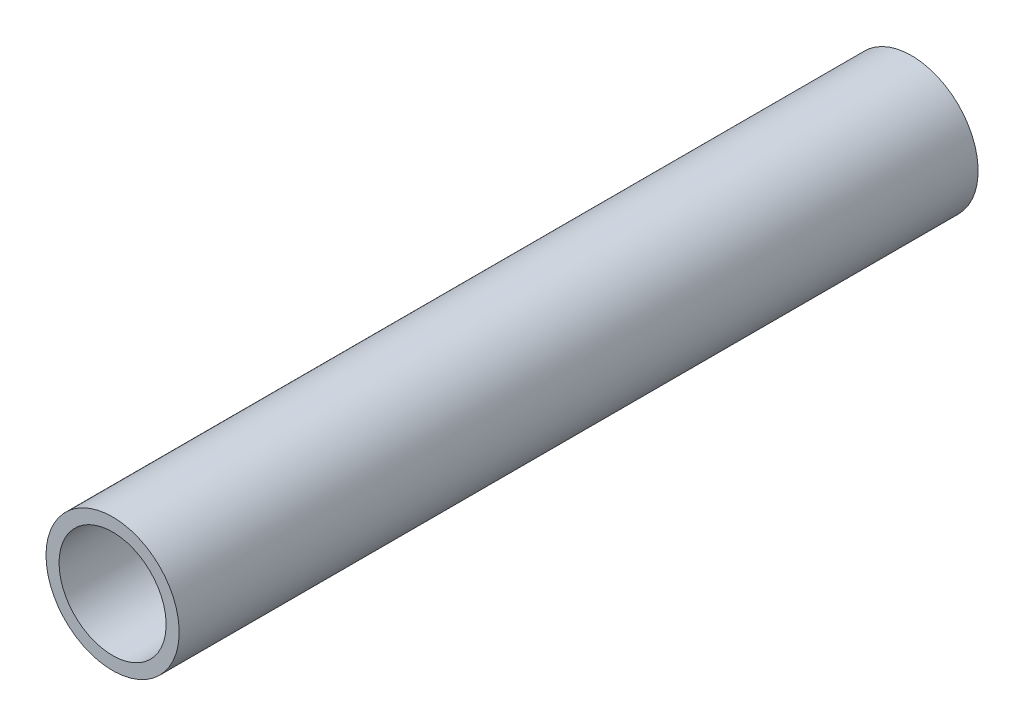
ISO-10303-21;
HEADER;
FILE_DESCRIPTION(('STEP AP214'),'2;1');
FILE_NAME('part.step','',(''),(''),'','','');
FILE_SCHEMA(('AUTOMOTIVE_DESIGN { 1 0 10303 214 1 1 1 1 }'));
ENDSEC;
DATA;
#1=APPLICATION_CONTEXT('core data for automotive mechanical design processes');
#2=APPLICATION_PROTOCOL_DEFINITION('international standard','automotive_design',2000,#1);
#3=PRODUCT_CONTEXT('',#1,'mechanical');
#4=PRODUCT('Part','Part','',(#3));
#5=PRODUCT_RELATED_PRODUCT_CATEGORY('part','',(#4));
#6=PRODUCT_DEFINITION_FORMATION('','',#4);
#7=PRODUCT_DEFINITION_CONTEXT('part definition',#1,'design');
#8=PRODUCT_DEFINITION('design','',#6,#7);
#9=PRODUCT_DEFINITION_SHAPE('','',#8);
#10=(LENGTH_UNIT() NAMED_UNIT(*) SI_UNIT(.MILLI.,.METRE.));
#11=(NAMED_UNIT(*) PLANE_ANGLE_UNIT() SI_UNIT($,.RADIAN.));
#12=(NAMED_UNIT(*) SI_UNIT($,.STERADIAN.) SOLID_ANGLE_UNIT());
#13=UNCERTAINTY_MEASURE_WITH_UNIT(LENGTH_MEASURE(1.E-05),#10,'distance_accuracy_value','');
#14=(GEOMETRIC_REPRESENTATION_CONTEXT(3) GLOBAL_UNCERTAINTY_ASSIGNED_CONTEXT((#13)) GLOBAL_UNIT_ASSIGNED_CONTEXT((#10,
#11,#12)) REPRESENTATION_CONTEXT('',''));
#15=CARTESIAN_POINT('',(0.,0.,0.));
#16=DIRECTION('',(0.,0.,1.));
#17=DIRECTION('',(1.,0.,0.));
#18=AXIS2_PLACEMENT_3D('',#15,#16,#17);
#19=CARTESIAN_POINT('',(0.,0.,76.2));
#20=DIRECTION('',(0.,0.,1.));
#21=DIRECTION('',(1.,0.,0.));
#22=AXIS2_PLACEMENT_3D('',#19,#20,#21);
#23=PLANE('',#22);
#24=CARTESIAN_POINT('',(0.,0.,76.2));
#25=DIRECTION('',(0.,0.,1.));
#26=DIRECTION('',(1.,0.,0.));
#27=AXIS2_PLACEMENT_3D('',#24,#25,#26);
#28=CIRCLE('',#27,6.35);
#29=CARTESIAN_POINT('',(-6.35,0.,76.2));
#30=VERTEX_POINT('',#29);
#31=EDGE_CURVE('E10',#30,#30,#28,.T.);
#32=ORIENTED_EDGE('',*,*,#31,.T.);
#33=EDGE_LOOP('',(#32));
#34=FACE_BOUND('',#33,.T.);
#35=CARTESIAN_POINT('',(0.,0.,76.2));
#36=DIRECTION('',(0.,0.,1.));
#37=DIRECTION('',(1.,0.,0.));
#38=AXIS2_PLACEMENT_3D('',#35,#36,#37);
#39=CIRCLE('',#38,5.1054);
#40=CARTESIAN_POINT('',(-5.1054,0.,76.2));
#41=VERTEX_POINT('',#40);
#42=EDGE_CURVE('E48',#41,#41,#39,.T.);
#43=ORIENTED_EDGE('',*,*,#42,.F.);
#44=EDGE_LOOP('',(#43));
#45=FACE_BOUND('',#44,.T.);
#46=ADVANCED_FACE('F37',(#34,#45),#23,.T.);
#47=CARTESIAN_POINT('',(0.,0.,0.));
#48=DIRECTION('',(0.,0.,1.));
#49=DIRECTION('',(1.,0.,0.));
#50=AXIS2_PLACEMENT_3D('',#47,#48,#49);
#51=PLANE('',#50);
#52=CARTESIAN_POINT('',(0.,0.,0.));
#53=DIRECTION('',(0.,0.,1.));
#54=DIRECTION('',(1.,0.,0.));
#55=AXIS2_PLACEMENT_3D('',#52,#53,#54);
#56=CIRCLE('',#55,6.35);
#57=CARTESIAN_POINT('',(-6.35,0.,0.));
#58=VERTEX_POINT('',#57);
#59=EDGE_CURVE('E41',#58,#58,#56,.T.);
#60=ORIENTED_EDGE('',*,*,#59,.F.);
#61=EDGE_LOOP('',(#60));
#62=FACE_BOUND('',#61,.T.);
#63=CARTESIAN_POINT('',(0.,0.,0.));
#64=DIRECTION('',(0.,0.,1.));
#65=DIRECTION('',(1.,0.,0.));
#66=AXIS2_PLACEMENT_3D('',#63,#64,#65);
#67=CIRCLE('',#66,5.1054);
#68=CARTESIAN_POINT('',(-5.1054,0.,0.));
#69=VERTEX_POINT('',#68);
#70=EDGE_CURVE('E50',#69,#69,#67,.T.);
#71=ORIENTED_EDGE('',*,*,#70,.T.);
#72=EDGE_LOOP('',(#71));
#73=FACE_BOUND('',#72,.T.);
#74=ADVANCED_FACE('F60',(#62,#73),#51,.F.);
#75=CARTESIAN_POINT('',(0.,0.,76.2));
#76=DIRECTION('',(0.,0.,-1.));
#77=DIRECTION('',(-1.,0.,0.));
#78=AXIS2_PLACEMENT_3D('',#75,#76,#77);
#79=CYLINDRICAL_SURFACE('',#78,6.35);
#80=CARTESIAN_POINT('',(-6.35,0.,76.2));
#81=CARTESIAN_POINT('',(-6.35,0.,75.40625));
#82=CARTESIAN_POINT('',(-6.35,0.,74.6125));
#83=CARTESIAN_POINT('',(-6.35,0.,73.025));
#84=CARTESIAN_POINT('',(-6.35,0.,72.23125));
#85=CARTESIAN_POINT('',(-6.35,0.,70.64375));
#86=CARTESIAN_POINT('',(-6.35,0.,69.85));
#87=CARTESIAN_POINT('',(-6.35,0.,68.2625));
#88=CARTESIAN_POINT('',(-6.35,0.,67.46875));
#89=CARTESIAN_POINT('',(-6.35,0.,65.88125));
#90=CARTESIAN_POINT('',(-6.35,0.,65.0875));
#91=CARTESIAN_POINT('',(-6.35,0.,63.5));
#92=CARTESIAN_POINT('',(-6.35,0.,62.70625));
#93=CARTESIAN_POINT('',(-6.35,0.,61.11875));
#94=CARTESIAN_POINT('',(-6.35,0.,60.325));
#95=CARTESIAN_POINT('',(-6.35,0.,58.7375));
#96=CARTESIAN_POINT('',(-6.35,0.,57.94375));
#97=CARTESIAN_POINT('',(-6.35,0.,56.35625));
#98=CARTESIAN_POINT('',(-6.35,0.,55.5625));
#99=CARTESIAN_POINT('',(-6.35,0.,53.975));
#100=CARTESIAN_POINT('',(-6.35,0.,53.18125));
#101=CARTESIAN_POINT('',(-6.35,0.,51.59375));
#102=CARTESIAN_POINT('',(-6.35,0.,50.8));
#103=CARTESIAN_POINT('',(-6.35,0.,49.2125));
#104=CARTESIAN_POINT('',(-6.35,0.,48.41875));
#105=CARTESIAN_POINT('',(-6.35,0.,46.83125));
#106=CARTESIAN_POINT('',(-6.35,0.,46.0375));
#107=CARTESIAN_POINT('',(-6.35,0.,44.45));
#108=CARTESIAN_POINT('',(-6.35,0.,43.65625));
#109=CARTESIAN_POINT('',(-6.35,0.,42.06875));
#110=CARTESIAN_POINT('',(-6.35,0.,41.275));
#111=CARTESIAN_POINT('',(-6.35,0.,39.6875));
#112=CARTESIAN_POINT('',(-6.35,0.,38.89375));
#113=CARTESIAN_POINT('',(-6.35,0.,37.30625));
#114=CARTESIAN_POINT('',(-6.35,0.,36.5125));
#115=CARTESIAN_POINT('',(-6.35,0.,34.925));
#116=CARTESIAN_POINT('',(-6.35,0.,34.13125));
#117=CARTESIAN_POINT('',(-6.35,0.,32.54375));
#118=CARTESIAN_POINT('',(-6.35,0.,31.75));
#119=CARTESIAN_POINT('',(-6.35,0.,30.1625));
#120=CARTESIAN_POINT('',(-6.35,0.,29.36875));
#121=CARTESIAN_POINT('',(-6.35,0.,27.78125));
#122=CARTESIAN_POINT('',(-6.35,0.,26.9875));
#123=CARTESIAN_POINT('',(-6.35,0.,25.4));
#124=CARTESIAN_POINT('',(-6.35,0.,24.60625));
#125=CARTESIAN_POINT('',(-6.35,0.,23.01875));
#126=CARTESIAN_POINT('',(-6.35,0.,22.225));
#127=CARTESIAN_POINT('',(-6.35,0.,20.6375));
#128=CARTESIAN_POINT('',(-6.35,0.,19.84375));
#129=CARTESIAN_POINT('',(-6.35,0.,18.25625));
#130=CARTESIAN_POINT('',(-6.35,0.,17.4625));
#131=CARTESIAN_POINT('',(-6.35,0.,15.875));
#132=CARTESIAN_POINT('',(-6.35,0.,15.08125));
#133=CARTESIAN_POINT('',(-6.35,0.,13.49375));
#134=CARTESIAN_POINT('',(-6.35,0.,12.7));
#135=CARTESIAN_POINT('',(-6.35,0.,11.1125));
#136=CARTESIAN_POINT('',(-6.35,0.,10.31875));
#137=CARTESIAN_POINT('',(-6.35,0.,8.73125));
#138=CARTESIAN_POINT('',(-6.35,0.,7.93750000000001));
#139=CARTESIAN_POINT('',(-6.35,0.,6.35));
#140=CARTESIAN_POINT('',(-6.35,0.,5.55625));
#141=CARTESIAN_POINT('',(-6.35,0.,3.96875));
#142=CARTESIAN_POINT('',(-6.35,0.,3.175));
#143=CARTESIAN_POINT('',(-6.35,0.,1.5875));
#144=CARTESIAN_POINT('',(-6.35,0.,0.793750000000001));
#145=CARTESIAN_POINT('',(-6.35,0.,0.));
#146=B_SPLINE_CURVE_WITH_KNOTS('',3,(#80,#81,#82,#83,#84,#85,#86,#87,#88,#89,#90,#91,#92,#93,
#94,#95,#96,#97,#98,#99,#100,#101,#102,#103,#104,#105,#106,#107,#108,#109,#110,#111,#112,#113,
#114,#115,#116,#117,#118,#119,#120,#121,#122,#123,#124,#125,#126,#127,#128,#129,#130,#131,#132,
#133,#134,#135,#136,#137,#138,#139,#140,#141,#142,#143,#144,#145),.UNSPECIFIED.,.F.,.F.,(4,2,2,
2,2,2,2,2,2,2,2,2,2,2,2,2,2,2,2,2,2,2,2,2,2,2,2,2,2,2,2,2,4),(0.,2.38124999999999,
4.76249999999999,7.14374999999999,9.52499999999999,11.90625,14.2875,16.66875,19.05,21.43125,
23.8125,26.19375,28.575,30.95625,33.3375,35.71875,38.1,40.48125,42.8625,45.24375,47.625,
50.00625,52.3875,54.76875,57.15,59.53125,61.9125,64.29375,66.675,69.05625,71.4375,73.81875,
76.2),.UNSPECIFIED.);
#147=EDGE_CURVE('BSEAM39',#30,#58,#146,.T.);
#148=ORIENTED_EDGE('',*,*,#31,.F.);
#149=ORIENTED_EDGE('',*,*,#59,.T.);
#150=ORIENTED_EDGE('',*,*,#147,.T.);
#151=ORIENTED_EDGE('',*,*,#147,.F.);
#152=EDGE_LOOP('',(#148,#150,#149,#151));
#153=FACE_BOUND('',#152,.T.);
#154=ADVANCED_FACE('F39',(#153),#79,.T.);
#155=CARTESIAN_POINT('',(0.,0.,76.2));
#156=DIRECTION('',(0.,0.,-1.));
#157=DIRECTION('',(-1.,0.,0.));
#158=AXIS2_PLACEMENT_3D('',#155,#156,#157);
#159=CYLINDRICAL_SURFACE('',#158,5.1054);
#160=CARTESIAN_POINT('',(-5.1054,0.,76.2));
#161=CARTESIAN_POINT('',(-5.1054,0.,75.40625));
#162=CARTESIAN_POINT('',(-5.1054,0.,74.6125));
#163=CARTESIAN_POINT('',(-5.1054,0.,73.025));
#164=CARTESIAN_POINT('',(-5.1054,0.,72.23125));
#165=CARTESIAN_POINT('',(-5.1054,0.,70.64375));
#166=CARTESIAN_POINT('',(-5.1054,0.,69.85));
#167=CARTESIAN_POINT('',(-5.1054,0.,68.2625));
#168=CARTESIAN_POINT('',(-5.1054,0.,67.46875));
#169=CARTESIAN_POINT('',(-5.1054,0.,65.88125));
#170=CARTESIAN_POINT('',(-5.1054,0.,65.0875));
#171=CARTESIAN_POINT('',(-5.1054,0.,63.5));
#172=CARTESIAN_POINT('',(-5.1054,0.,62.70625));
#173=CARTESIAN_POINT('',(-5.1054,0.,61.11875));
#174=CARTESIAN_POINT('',(-5.1054,0.,60.325));
#175=CARTESIAN_POINT('',(-5.1054,0.,58.7375));
#176=CARTESIAN_POINT('',(-5.1054,0.,57.94375));
#177=CARTESIAN_POINT('',(-5.1054,0.,56.35625));
#178=CARTESIAN_POINT('',(-5.1054,0.,55.5625));
#179=CARTESIAN_POINT('',(-5.1054,0.,53.975));
#180=CARTESIAN_POINT('',(-5.1054,0.,53.18125));
#181=CARTESIAN_POINT('',(-5.1054,0.,51.59375));
#182=CARTESIAN_POINT('',(-5.1054,0.,50.8));
#183=CARTESIAN_POINT('',(-5.1054,0.,49.2125));
#184=CARTESIAN_POINT('',(-5.1054,0.,48.41875));
#185=CARTESIAN_POINT('',(-5.1054,0.,46.83125));
#186=CARTESIAN_POINT('',(-5.1054,0.,46.0375));
#187=CARTESIAN_POINT('',(-5.1054,0.,44.45));
#188=CARTESIAN_POINT('',(-5.1054,0.,43.65625));
#189=CARTESIAN_POINT('',(-5.1054,0.,42.06875));
#190=CARTESIAN_POINT('',(-5.1054,0.,41.275));
#191=CARTESIAN_POINT('',(-5.1054,0.,39.6875));
#192=CARTESIAN_POINT('',(-5.1054,0.,38.89375));
#193=CARTESIAN_POINT('',(-5.1054,0.,37.30625));
#194=CARTESIAN_POINT('',(-5.1054,0.,36.5125));
#195=CARTESIAN_POINT('',(-5.1054,0.,34.925));
#196=CARTESIAN_POINT('',(-5.1054,0.,34.13125));
#197=CARTESIAN_POINT('',(-5.1054,0.,32.54375));
#198=CARTESIAN_POINT('',(-5.1054,0.,31.75));
#199=CARTESIAN_POINT('',(-5.1054,0.,30.1625));
#200=CARTESIAN_POINT('',(-5.1054,0.,29.36875));
#201=CARTESIAN_POINT('',(-5.1054,0.,27.78125));
#202=CARTESIAN_POINT('',(-5.1054,0.,26.9875));
#203=CARTESIAN_POINT('',(-5.1054,0.,25.4));
#204=CARTESIAN_POINT('',(-5.1054,0.,24.60625));
#205=CARTESIAN_POINT('',(-5.1054,0.,23.01875));
#206=CARTESIAN_POINT('',(-5.1054,0.,22.225));
#207=CARTESIAN_POINT('',(-5.1054,0.,20.6375));
#208=CARTESIAN_POINT('',(-5.1054,0.,19.84375));
#209=CARTESIAN_POINT('',(-5.1054,0.,18.25625));
#210=CARTESIAN_POINT('',(-5.1054,0.,17.4625));
#211=CARTESIAN_POINT('',(-5.1054,0.,15.875));
#212=CARTESIAN_POINT('',(-5.1054,0.,15.08125));
#213=CARTESIAN_POINT('',(-5.1054,0.,13.49375));
#214=CARTESIAN_POINT('',(-5.1054,0.,12.7));
#215=CARTESIAN_POINT('',(-5.1054,0.,11.1125));
#216=CARTESIAN_POINT('',(-5.1054,0.,10.31875));
#217=CARTESIAN_POINT('',(-5.1054,0.,8.73125));
#218=CARTESIAN_POINT('',(-5.1054,0.,7.93750000000001));
#219=CARTESIAN_POINT('',(-5.1054,0.,6.35));
#220=CARTESIAN_POINT('',(-5.1054,0.,5.55625));
#221=CARTESIAN_POINT('',(-5.1054,0.,3.96875));
#222=CARTESIAN_POINT('',(-5.1054,0.,3.175));
#223=CARTESIAN_POINT('',(-5.1054,0.,1.5875));
#224=CARTESIAN_POINT('',(-5.1054,0.,0.793750000000001));
#225=CARTESIAN_POINT('',(-5.1054,0.,0.));
#226=B_SPLINE_CURVE_WITH_KNOTS('',3,(#160,#161,#162,#163,#164,#165,#166,#167,#168,#169,#170,
#171,#172,#173,#174,#175,#176,#177,#178,#179,#180,#181,#182,#183,#184,#185,#186,#187,#188,#189,
#190,#191,#192,#193,#194,#195,#196,#197,#198,#199,#200,#201,#202,#203,#204,#205,#206,#207,#208,
#209,#210,#211,#212,#213,#214,#215,#216,#217,#218,#219,#220,#221,#222,#223,#224,#225),
.UNSPECIFIED.,.F.,.F.,(4,2,2,2,2,2,2,2,2,2,2,2,2,2,2,2,2,2,2,2,2,2,2,2,2,2,2,2,2,2,2,2,4),(0.,
2.38124999999999,4.76249999999999,7.14374999999999,9.52499999999999,11.90625,14.2875,16.66875,
19.05,21.43125,23.8125,26.19375,28.575,30.95625,33.3375,35.71875,38.1,40.48125,42.8625,45.24375,
47.625,50.00625,52.3875,54.76875,57.15,59.53125,61.9125,64.29375,66.675,69.05625,71.4375,
73.81875,76.2),.UNSPECIFIED.);
#227=EDGE_CURVE('BSEAM56',#41,#69,#226,.T.);
#228=ORIENTED_EDGE('',*,*,#42,.T.);
#229=ORIENTED_EDGE('',*,*,#70,.F.);
#230=ORIENTED_EDGE('',*,*,#227,.T.);
#231=ORIENTED_EDGE('',*,*,#227,.F.);
#232=EDGE_LOOP('',(#228,#230,#229,#231));
#233=FACE_BOUND('',#232,.T.);
#234=ADVANCED_FACE('F56',(#233),#159,.F.);
#235=CLOSED_SHELL('',(#46,#74,#154,#234));
#236=MANIFOLD_SOLID_BREP('B2',#235);
#237=ADVANCED_BREP_SHAPE_REPRESENTATION('',(#18,#236),#14);
#238=SHAPE_DEFINITION_REPRESENTATION(#9,#237);
ENDSEC;
END-ISO-10303-21;
